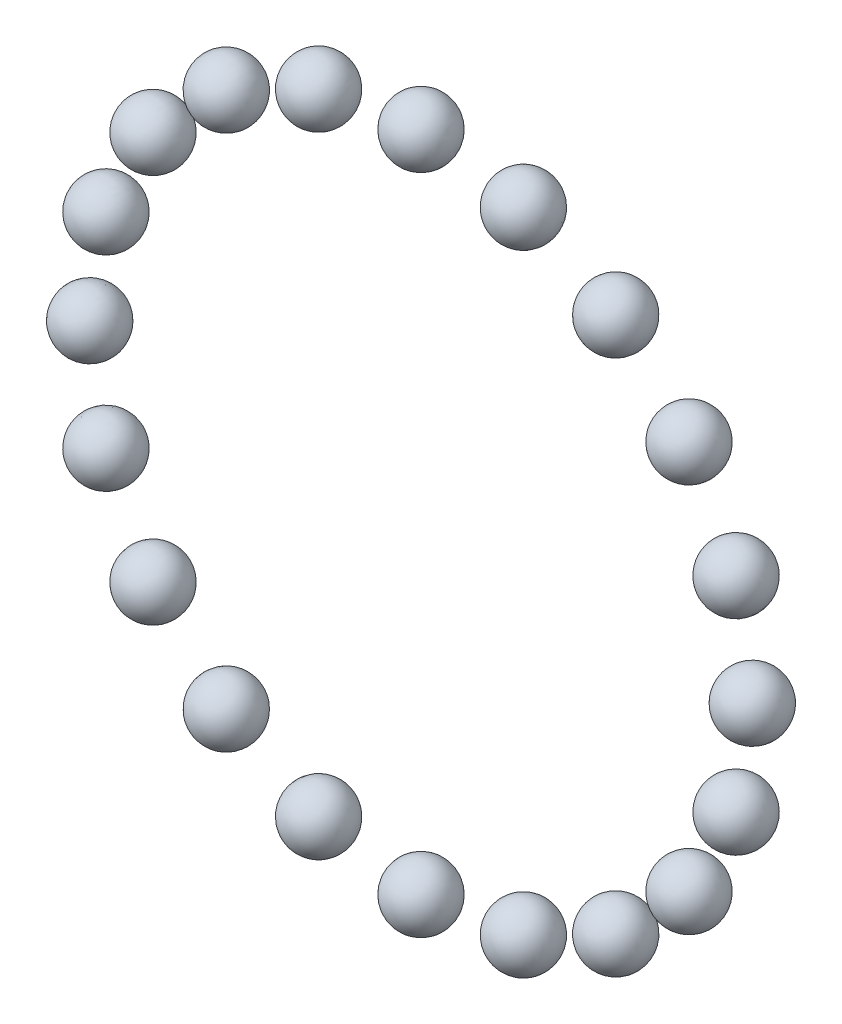
ISO-10303-21;
HEADER;
FILE_DESCRIPTION(('STEP AP214'),'2;1');
FILE_NAME('part.step','',(''),(''),'','','');
FILE_SCHEMA(('AUTOMOTIVE_DESIGN { 1 0 10303 214 1 1 1 1 }'));
ENDSEC;
DATA;
#1=APPLICATION_CONTEXT('core data for automotive mechanical design processes');
#2=APPLICATION_PROTOCOL_DEFINITION('international standard','automotive_design',2000,#1);
#3=PRODUCT_CONTEXT('',#1,'mechanical');
#4=PRODUCT('Part','Part','',(#3));
#5=PRODUCT_RELATED_PRODUCT_CATEGORY('part','',(#4));
#6=PRODUCT_DEFINITION_FORMATION('','',#4);
#7=PRODUCT_DEFINITION_CONTEXT('part definition',#1,'design');
#8=PRODUCT_DEFINITION('design','',#6,#7);
#9=PRODUCT_DEFINITION_SHAPE('','',#8);
#10=(LENGTH_UNIT() NAMED_UNIT(*) SI_UNIT(.MILLI.,.METRE.));
#11=(NAMED_UNIT(*) PLANE_ANGLE_UNIT() SI_UNIT($,.RADIAN.));
#12=(NAMED_UNIT(*) SI_UNIT($,.STERADIAN.) SOLID_ANGLE_UNIT());
#13=UNCERTAINTY_MEASURE_WITH_UNIT(LENGTH_MEASURE(1.E-05),#10,'distance_accuracy_value','');
#14=(GEOMETRIC_REPRESENTATION_CONTEXT(3) GLOBAL_UNCERTAINTY_ASSIGNED_CONTEXT((#13)) GLOBAL_UNIT_ASSIGNED_CONTEXT((#10,
#11,#12)) REPRESENTATION_CONTEXT('',''));
#15=CARTESIAN_POINT('',(0.,0.,0.));
#16=DIRECTION('',(0.,0.,1.));
#17=DIRECTION('',(1.,0.,0.));
#18=AXIS2_PLACEMENT_3D('',#15,#16,#17);
#19=CARTESIAN_POINT('',(-30.9093367795926,10.0430523171854,0.));
#20=DIRECTION('',(-0.951056516295158,0.309016994374935,0.));
#21=DIRECTION('',(0.309016994374935,0.951056516295158,0.));
#22=AXIS2_PLACEMENT_3D('',#19,#20,#21);
#23=SPHERICAL_SURFACE('',#22,2.99999999999999);
#24=CARTESIAN_POINT('',(-33.7625063284781,10.9701033003102,0.));
#25=VERTEX_POINT('',#24);
#26=VERTEX_LOOP('',#25);
#27=FACE_BOUND('',#26,.T.);
#28=ADVANCED_FACE('F38',(#27),#23,.T.);
#29=CLOSED_SHELL('',(#28));
#30=MANIFOLD_SOLID_BREP('B2',#29);
#31=CARTESIAN_POINT('',(-26.293052317186,19.103020699505,0.));
#32=DIRECTION('',(-0.809016994374955,0.587785252292462,0.));
#33=DIRECTION('',(0.587785252292462,0.809016994374955,0.));
#34=AXIS2_PLACEMENT_3D('',#31,#32,#33);
#35=SPHERICAL_SURFACE('',#34,2.99999999999999);
#36=CARTESIAN_POINT('',(-28.7201033003109,20.8663764563824,0.));
#37=VERTEX_POINT('',#36);
#38=VERTEX_LOOP('',#37);
#39=FACE_BOUND('',#38,.T.);
#40=ADVANCED_FACE('F57',(#39),#35,.T.);
#41=CLOSED_SHELL('',(#40));
#42=MANIFOLD_SOLID_BREP('B6',#41);
#43=CARTESIAN_POINT('',(-19.1030206995057,26.2930523171856,0.));
#44=DIRECTION('',(-0.587785252292483,0.80901699437494,0.));
#45=DIRECTION('',(0.80901699437494,0.587785252292483,0.));
#46=AXIS2_PLACEMENT_3D('',#43,#44,#45);
#47=SPHERICAL_SURFACE('',#46,2.99999999999999);
#48=CARTESIAN_POINT('',(-20.8663764563831,28.7201033003104,0.));
#49=VERTEX_POINT('',#48);
#50=VERTEX_LOOP('',#49);
#51=FACE_BOUND('',#50,.T.);
#52=ADVANCED_FACE('F76',(#51),#47,.T.);
#53=CLOSED_SHELL('',(#52));
#54=MANIFOLD_SOLID_BREP('B34',#53);
#55=CARTESIAN_POINT('',(-10.0430523171861,30.9093367795924,0.));
#56=DIRECTION('',(-0.309016994374958,0.95105651629515,0.));
#57=DIRECTION('',(0.95105651629515,0.309016994374958,0.));
#58=AXIS2_PLACEMENT_3D('',#55,#56,#57);
#59=SPHERICAL_SURFACE('',#58,2.99999999999999);
#60=CARTESIAN_POINT('',(-10.970103300311,33.7625063284778,0.));
#61=VERTEX_POINT('',#60);
#62=VERTEX_LOOP('',#61);
#63=FACE_BOUND('',#62,.T.);
#64=ADVANCED_FACE('F95',(#63),#59,.T.);
#65=CLOSED_SHELL('',(#64));
#66=MANIFOLD_SOLID_BREP('B53',#65);
#67=CARTESIAN_POINT('',(-3.40419430537206E-13,32.5,0.));
#68=DIRECTION('',(0.,1.,0.));
#69=DIRECTION('',(1.,0.,0.));
#70=AXIS2_PLACEMENT_3D('',#67,#68,#69);
#71=SPHERICAL_SURFACE('',#70,2.99999999999999);
#72=CARTESIAN_POINT('',(-3.71842762586794E-13,35.5,0.));
#73=VERTEX_POINT('',#72);
#74=VERTEX_LOOP('',#73);
#75=FACE_BOUND('',#74,.T.);
#76=ADVANCED_FACE('F114',(#75),#71,.T.);
#77=CLOSED_SHELL('',(#76));
#78=MANIFOLD_SOLID_BREP('B72',#77);
#79=CARTESIAN_POINT('',(10.0430523171855,30.9093367795926,0.));
#80=DIRECTION('',(0.309016994374938,0.951056516295157,0.));
#81=DIRECTION('',(0.951056516295157,-0.309016994374938,0.));
#82=AXIS2_PLACEMENT_3D('',#79,#80,#81);
#83=SPHERICAL_SURFACE('',#82,2.99999999999999);
#84=CARTESIAN_POINT('',(10.9701033003103,33.762506328478,0.));
#85=VERTEX_POINT('',#84);
#86=VERTEX_LOOP('',#85);
#87=FACE_BOUND('',#86,.T.);
#88=ADVANCED_FACE('F133',(#87),#83,.T.);
#89=CLOSED_SHELL('',(#88));
#90=MANIFOLD_SOLID_BREP('B91',#89);
#91=CARTESIAN_POINT('',(19.1030206995051,26.293052317186,0.));
#92=DIRECTION('',(0.587785252292465,0.809016994374953,0.));
#93=DIRECTION('',(0.809016994374953,-0.587785252292465,0.));
#94=AXIS2_PLACEMENT_3D('',#91,#92,#93);
#95=SPHERICAL_SURFACE('',#94,2.99999999999999);
#96=CARTESIAN_POINT('',(20.8663764563825,28.7201033003108,0.));
#97=VERTEX_POINT('',#96);
#98=VERTEX_LOOP('',#97);
#99=FACE_BOUND('',#98,.T.);
#100=ADVANCED_FACE('F152',(#99),#95,.T.);
#101=CLOSED_SHELL('',(#100));
#102=MANIFOLD_SOLID_BREP('B110',#101);
#103=CARTESIAN_POINT('',(26.2930523171856,19.1030206995056,0.));
#104=DIRECTION('',(0.809016994374942,0.58778525229248,0.));
#105=DIRECTION('',(0.58778525229248,-0.809016994374942,0.));
#106=AXIS2_PLACEMENT_3D('',#103,#104,#105);
#107=SPHERICAL_SURFACE('',#106,2.99999999999999);
#108=CARTESIAN_POINT('',(28.7201033003104,20.866376456383,0.));
#109=VERTEX_POINT('',#108);
#110=VERTEX_LOOP('',#109);
#111=FACE_BOUND('',#110,.T.);
#112=ADVANCED_FACE('F171',(#111),#107,.T.);
#113=CLOSED_SHELL('',(#112));
#114=MANIFOLD_SOLID_BREP('B129',#113);
#115=CARTESIAN_POINT('',(30.9093367795924,10.043052317186,0.));
#116=DIRECTION('',(0.951056516295151,0.309016994374955,0.));
#117=DIRECTION('',(0.309016994374955,-0.951056516295151,0.));
#118=AXIS2_PLACEMENT_3D('',#115,#116,#117);
#119=SPHERICAL_SURFACE('',#118,2.99999999999999);
#120=CARTESIAN_POINT('',(33.7625063284779,10.9701033003109,0.));
#121=VERTEX_POINT('',#120);
#122=VERTEX_LOOP('',#121);
#123=FACE_BOUND('',#122,.T.);
#124=ADVANCED_FACE('F190',(#123),#119,.T.);
#125=CLOSED_SHELL('',(#124));
#126=MANIFOLD_SOLID_BREP('B148',#125);
#127=CARTESIAN_POINT('',(32.5,0.,0.));
#128=DIRECTION('',(1.,0.,0.));
#129=DIRECTION('',(0.,-1.,0.));
#130=AXIS2_PLACEMENT_3D('',#127,#128,#129);
#131=SPHERICAL_SURFACE('',#130,2.99999999999999);
#132=CARTESIAN_POINT('',(35.5,0.,0.));
#133=VERTEX_POINT('',#132);
#134=VERTEX_LOOP('',#133);
#135=FACE_BOUND('',#134,.T.);
#136=ADVANCED_FACE('F209',(#135),#131,.T.);
#137=CLOSED_SHELL('',(#136));
#138=MANIFOLD_SOLID_BREP('B167',#137);
#139=CARTESIAN_POINT('',(30.9093367795926,-10.0430523171856,0.));
#140=DIRECTION('',(0.951056516295156,-0.309016994374941,0.));
#141=DIRECTION('',(-0.309016994374941,-0.951056516295156,0.));
#142=AXIS2_PLACEMENT_3D('',#139,#140,#141);
#143=SPHERICAL_SURFACE('',#142,2.99999999999999);
#144=CARTESIAN_POINT('',(33.762506328478,-10.9701033003104,0.));
#145=VERTEX_POINT('',#144);
#146=VERTEX_LOOP('',#145);
#147=FACE_BOUND('',#146,.T.);
#148=ADVANCED_FACE('F228',(#147),#143,.T.);
#149=CLOSED_SHELL('',(#148));
#150=MANIFOLD_SOLID_BREP('B186',#149);
#151=CARTESIAN_POINT('',(26.2930523171859,-19.1030206995052,0.));
#152=DIRECTION('',(0.809016994374951,-0.587785252292469,0.));
#153=DIRECTION('',(-0.587785252292469,-0.809016994374951,0.));
#154=AXIS2_PLACEMENT_3D('',#151,#152,#153);
#155=SPHERICAL_SURFACE('',#154,2.99999999999999);
#156=CARTESIAN_POINT('',(28.7201033003108,-20.8663764563826,0.));
#157=VERTEX_POINT('',#156);
#158=VERTEX_LOOP('',#157);
#159=FACE_BOUND('',#158,.T.);
#160=ADVANCED_FACE('F247',(#159),#155,.T.);
#161=CLOSED_SHELL('',(#160));
#162=MANIFOLD_SOLID_BREP('B205',#161);
#163=CARTESIAN_POINT('',(19.1030206995055,-26.2930523171857,0.));
#164=DIRECTION('',(0.587785252292477,-0.809016994374945,0.));
#165=DIRECTION('',(-0.809016994374945,-0.587785252292477,0.));
#166=AXIS2_PLACEMENT_3D('',#163,#164,#165);
#167=SPHERICAL_SURFACE('',#166,2.99999999999999);
#168=CARTESIAN_POINT('',(20.8663764563829,-28.7201033003105,0.));
#169=VERTEX_POINT('',#168);
#170=VERTEX_LOOP('',#169);
#171=FACE_BOUND('',#170,.T.);
#172=ADVANCED_FACE('F266',(#171),#167,.T.);
#173=CLOSED_SHELL('',(#172));
#174=MANIFOLD_SOLID_BREP('B224',#173);
#175=CARTESIAN_POINT('',(10.0430523171859,-30.9093367795925,0.));
#176=DIRECTION('',(0.309016994374952,-0.951056516295152,0.));
#177=DIRECTION('',(-0.951056516295152,-0.309016994374952,0.));
#178=AXIS2_PLACEMENT_3D('',#175,#176,#177);
#179=SPHERICAL_SURFACE('',#178,2.99999999999999);
#180=CARTESIAN_POINT('',(10.9701033003108,-33.7625063284779,0.));
#181=VERTEX_POINT('',#180);
#182=VERTEX_LOOP('',#181);
#183=FACE_BOUND('',#182,.T.);
#184=ADVANCED_FACE('F285',(#183),#179,.T.);
#185=CLOSED_SHELL('',(#184));
#186=MANIFOLD_SOLID_BREP('B243',#185);
#187=CARTESIAN_POINT('',(1.13473143512402E-13,-32.5,0.));
#188=DIRECTION('',(0.,-1.,0.));
#189=DIRECTION('',(-1.,0.,0.));
#190=AXIS2_PLACEMENT_3D('',#187,#188,#189);
#191=SPHERICAL_SURFACE('',#190,2.99999999999999);
#192=CARTESIAN_POINT('',(1.23947587528931E-13,-35.5,0.));
#193=VERTEX_POINT('',#192);
#194=VERTEX_LOOP('',#193);
#195=FACE_BOUND('',#194,.T.);
#196=ADVANCED_FACE('F304',(#195),#191,.T.);
#197=CLOSED_SHELL('',(#196));
#198=MANIFOLD_SOLID_BREP('B262',#197);
#199=CARTESIAN_POINT('',(-10.0430523171857,-30.9093367795925,0.));
#200=DIRECTION('',(-0.309016994374945,-0.951056516295155,0.));
#201=DIRECTION('',(-0.951056516295155,0.309016994374945,0.));
#202=AXIS2_PLACEMENT_3D('',#199,#200,#201);
#203=SPHERICAL_SURFACE('',#202,2.99999999999999);
#204=CARTESIAN_POINT('',(-10.9701033003105,-33.762506328478,0.));
#205=VERTEX_POINT('',#204);
#206=VERTEX_LOOP('',#205);
#207=FACE_BOUND('',#206,.T.);
#208=ADVANCED_FACE('F323',(#207),#203,.T.);
#209=CLOSED_SHELL('',(#208));
#210=MANIFOLD_SOLID_BREP('B281',#209);
#211=CARTESIAN_POINT('',(-19.1030206995053,-26.2930523171858,0.));
#212=DIRECTION('',(-0.587785252292471,-0.809016994374949,0.));
#213=DIRECTION('',(-0.809016994374949,0.587785252292471,0.));
#214=AXIS2_PLACEMENT_3D('',#211,#212,#213);
#215=SPHERICAL_SURFACE('',#214,2.99999999999999);
#216=CARTESIAN_POINT('',(-20.8663764563827,-28.7201033003107,0.));
#217=VERTEX_POINT('',#216);
#218=VERTEX_LOOP('',#217);
#219=FACE_BOUND('',#218,.T.);
#220=ADVANCED_FACE('F342',(#219),#215,.T.);
#221=CLOSED_SHELL('',(#220));
#222=MANIFOLD_SOLID_BREP('B300',#221);
#223=CARTESIAN_POINT('',(-26.2930523171858,-19.1030206995054,0.));
#224=DIRECTION('',(-0.809016994374947,-0.587785252292474,0.));
#225=DIRECTION('',(-0.587785252292474,0.809016994374947,0.));
#226=AXIS2_PLACEMENT_3D('',#223,#224,#225);
#227=SPHERICAL_SURFACE('',#226,2.99999999999999);
#228=CARTESIAN_POINT('',(-28.7201033003106,-20.8663764563828,0.));
#229=VERTEX_POINT('',#228);
#230=VERTEX_LOOP('',#229);
#231=FACE_BOUND('',#230,.T.);
#232=ADVANCED_FACE('F361',(#231),#227,.T.);
#233=CLOSED_SHELL('',(#232));
#234=MANIFOLD_SOLID_BREP('B319',#233);
#235=CARTESIAN_POINT('',(-30.9093367795925,-10.0430523171858,0.));
#236=DIRECTION('',(-0.951056516295154,-0.309016994374948,0.));
#237=DIRECTION('',(-0.309016994374948,0.951056516295154,0.));
#238=AXIS2_PLACEMENT_3D('',#235,#236,#237);
#239=SPHERICAL_SURFACE('',#238,2.99999999999999);
#240=CARTESIAN_POINT('',(-33.7625063284779,-10.9701033003107,0.));
#241=VERTEX_POINT('',#240);
#242=VERTEX_LOOP('',#241);
#243=FACE_BOUND('',#242,.T.);
#244=ADVANCED_FACE('F379',(#243),#239,.T.);
#245=CLOSED_SHELL('',(#244));
#246=MANIFOLD_SOLID_BREP('B338',#245);
#247=CARTESIAN_POINT('',(-32.5,0.,0.));
#248=DIRECTION('',(-1.,0.,0.));
#249=DIRECTION('',(0.,1.,0.));
#250=AXIS2_PLACEMENT_3D('',#247,#248,#249);
#251=SPHERICAL_SURFACE('',#250,2.99999999999999);
#252=CARTESIAN_POINT('',(-35.5,0.,0.));
#253=VERTEX_POINT('',#252);
#254=VERTEX_LOOP('',#253);
#255=FACE_BOUND('',#254,.T.);
#256=ADVANCED_FACE('F392',(#255),#251,.T.);
#257=CLOSED_SHELL('',(#256));
#258=MANIFOLD_SOLID_BREP('B357',#257);
#259=ADVANCED_BREP_SHAPE_REPRESENTATION('',(#18,#30,#42,#54,#66,#78,#90,#102,#114,#126,#138,
#150,#162,#174,#186,#198,#210,#222,#234,#246,#258),#14);
#260=SHAPE_DEFINITION_REPRESENTATION(#9,#259);
ENDSEC;
END-ISO-10303-21;
